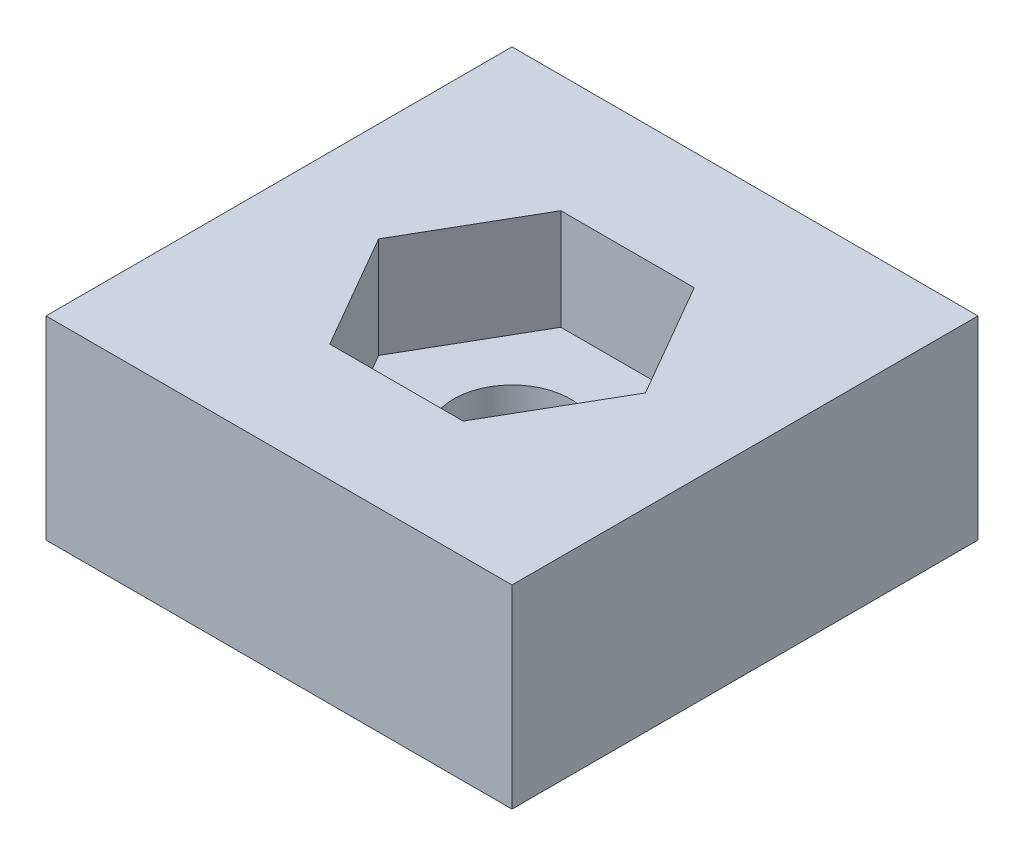
ISO-10303-21;
HEADER;
FILE_DESCRIPTION(('STEP AP214'),'2;1');
FILE_NAME('part.step','',(''),(''),'','','');
FILE_SCHEMA(('AUTOMOTIVE_DESIGN { 1 0 10303 214 1 1 1 1 }'));
ENDSEC;
DATA;
#1=APPLICATION_CONTEXT('core data for automotive mechanical design processes');
#2=APPLICATION_PROTOCOL_DEFINITION('international standard','automotive_design',2000,#1);
#3=PRODUCT_CONTEXT('',#1,'mechanical');
#4=PRODUCT('Part','Part','',(#3));
#5=PRODUCT_RELATED_PRODUCT_CATEGORY('part','',(#4));
#6=PRODUCT_DEFINITION_FORMATION('','',#4);
#7=PRODUCT_DEFINITION_CONTEXT('part definition',#1,'design');
#8=PRODUCT_DEFINITION('design','',#6,#7);
#9=PRODUCT_DEFINITION_SHAPE('','',#8);
#10=(LENGTH_UNIT() NAMED_UNIT(*) SI_UNIT(.MILLI.,.METRE.));
#11=(NAMED_UNIT(*) PLANE_ANGLE_UNIT() SI_UNIT($,.RADIAN.));
#12=(NAMED_UNIT(*) SI_UNIT($,.STERADIAN.) SOLID_ANGLE_UNIT());
#13=UNCERTAINTY_MEASURE_WITH_UNIT(LENGTH_MEASURE(1.E-05),#10,'distance_accuracy_value','');
#14=(GEOMETRIC_REPRESENTATION_CONTEXT(3) GLOBAL_UNCERTAINTY_ASSIGNED_CONTEXT((#13)) GLOBAL_UNIT_ASSIGNED_CONTEXT((#10,
#11,#12)) REPRESENTATION_CONTEXT('',''));
#15=CARTESIAN_POINT('',(0.,0.,0.));
#16=DIRECTION('',(0.,0.,1.));
#17=DIRECTION('',(1.,0.,0.));
#18=AXIS2_PLACEMENT_3D('',#15,#16,#17);
#19=CARTESIAN_POINT('',(0.,0.,0.));
#20=DIRECTION('',(0.,1.,0.));
#21=DIRECTION('',(0.,0.,1.));
#22=AXIS2_PLACEMENT_3D('',#19,#20,#21);
#23=CYLINDRICAL_SURFACE('',#22,1.5);
#24=CARTESIAN_POINT('',(0.,0.,0.));
#25=DIRECTION('',(0.,1.,0.));
#26=DIRECTION('',(0.,0.,1.));
#27=AXIS2_PLACEMENT_3D('',#24,#25,#26);
#28=CIRCLE('',#27,1.5);
#29=CARTESIAN_POINT('',(0.,0.,1.5));
#30=VERTEX_POINT('',#29);
#31=EDGE_CURVE('E204',#30,#30,#28,.T.);
#32=ORIENTED_EDGE('',*,*,#31,.F.);
#33=EDGE_LOOP('',(#32));
#34=FACE_BOUND('',#33,.T.);
#35=CARTESIAN_POINT('',(0.,2.4,0.));
#36=DIRECTION('',(0.,1.,0.));
#37=DIRECTION('',(0.,0.,1.));
#38=AXIS2_PLACEMENT_3D('',#35,#36,#37);
#39=CIRCLE('',#38,1.5);
#40=CARTESIAN_POINT('',(0.,2.4,1.5));
#41=VERTEX_POINT('',#40);
#42=EDGE_CURVE('E47',#41,#41,#39,.F.);
#43=ORIENTED_EDGE('',*,*,#42,.F.);
#44=EDGE_LOOP('',(#43));
#45=FACE_BOUND('',#44,.T.);
#46=ADVANCED_FACE('F43',(#34,#45),#23,.F.);
#47=CARTESIAN_POINT('',(6.,5.,6.));
#48=DIRECTION('',(-1.,0.,0.));
#49=DIRECTION('',(0.,0.,1.));
#50=AXIS2_PLACEMENT_3D('',#47,#48,#49);
#51=PLANE('',#50);
#52=DIRECTION('',(0.,0.,-1.));
#53=VECTOR('',#52,1.);
#54=CARTESIAN_POINT('',(6.,0.,6.));
#55=LINE('',#54,#53);
#56=CARTESIAN_POINT('',(6.,0.,6.));
#57=VERTEX_POINT('',#56);
#58=CARTESIAN_POINT('',(6.,0.,-6.));
#59=VERTEX_POINT('',#58);
#60=EDGE_CURVE('E208',#57,#59,#55,.T.);
#61=ORIENTED_EDGE('',*,*,#60,.T.);
#62=DIRECTION('',(0.,-1.,0.));
#63=VECTOR('',#62,1.);
#64=CARTESIAN_POINT('',(6.,5.,-6.));
#65=LINE('',#64,#63);
#66=CARTESIAN_POINT('',(6.,5.,-6.));
#67=VERTEX_POINT('',#66);
#68=EDGE_CURVE('E11',#67,#59,#65,.T.);
#69=ORIENTED_EDGE('',*,*,#68,.F.);
#70=DIRECTION('',(0.,0.,-1.));
#71=VECTOR('',#70,1.);
#72=CARTESIAN_POINT('',(6.,5.,6.));
#73=LINE('',#72,#71);
#74=CARTESIAN_POINT('',(6.,5.,6.));
#75=VERTEX_POINT('',#74);
#76=EDGE_CURVE('E209',#75,#67,#73,.T.);
#77=ORIENTED_EDGE('',*,*,#76,.F.);
#78=DIRECTION('',(0.,-1.,0.));
#79=VECTOR('',#78,1.);
#80=CARTESIAN_POINT('',(6.,5.,6.));
#81=LINE('',#80,#79);
#82=EDGE_CURVE('E219',#75,#57,#81,.T.);
#83=ORIENTED_EDGE('',*,*,#82,.T.);
#84=EDGE_LOOP('',(#61,#69,#77,#83));
#85=FACE_BOUND('',#84,.T.);
#86=ADVANCED_FACE('F45',(#85),#51,.F.);
#87=CARTESIAN_POINT('',(-6.,5.,-6.));
#88=DIRECTION('',(0.,0.,1.));
#89=DIRECTION('',(1.,0.,0.));
#90=AXIS2_PLACEMENT_3D('',#87,#88,#89);
#91=PLANE('',#90);
#92=DIRECTION('',(-1.,0.,0.));
#93=VECTOR('',#92,1.);
#94=CARTESIAN_POINT('',(-6.,0.,-6.));
#95=LINE('',#94,#93);
#96=CARTESIAN_POINT('',(-6.,0.,-6.));
#97=VERTEX_POINT('',#96);
#98=EDGE_CURVE('E223',#59,#97,#95,.T.);
#99=ORIENTED_EDGE('',*,*,#98,.T.);
#100=DIRECTION('',(0.,-1.,0.));
#101=VECTOR('',#100,1.);
#102=CARTESIAN_POINT('',(-6.,5.,-6.));
#103=LINE('',#102,#101);
#104=CARTESIAN_POINT('',(-6.,5.,-6.));
#105=VERTEX_POINT('',#104);
#106=EDGE_CURVE('E53',#105,#97,#103,.T.);
#107=ORIENTED_EDGE('',*,*,#106,.F.);
#108=DIRECTION('',(-1.,0.,0.));
#109=VECTOR('',#108,1.);
#110=CARTESIAN_POINT('',(-6.,5.,-6.));
#111=LINE('',#110,#109);
#112=EDGE_CURVE('E97',#67,#105,#111,.T.);
#113=ORIENTED_EDGE('',*,*,#112,.F.);
#114=ORIENTED_EDGE('',*,*,#68,.T.);
#115=EDGE_LOOP('',(#99,#107,#113,#114));
#116=FACE_BOUND('',#115,.T.);
#117=ADVANCED_FACE('F259',(#116),#91,.F.);
#118=CARTESIAN_POINT('',(-6.,5.,6.));
#119=DIRECTION('',(1.,0.,0.));
#120=DIRECTION('',(0.,0.,-1.));
#121=AXIS2_PLACEMENT_3D('',#118,#119,#120);
#122=PLANE('',#121);
#123=DIRECTION('',(0.,0.,1.));
#124=VECTOR('',#123,1.);
#125=CARTESIAN_POINT('',(-6.,0.,6.));
#126=LINE('',#125,#124);
#127=CARTESIAN_POINT('',(-6.,0.,6.));
#128=VERTEX_POINT('',#127);
#129=EDGE_CURVE('E226',#97,#128,#126,.T.);
#130=ORIENTED_EDGE('',*,*,#129,.T.);
#131=DIRECTION('',(0.,-1.,0.));
#132=VECTOR('',#131,1.);
#133=CARTESIAN_POINT('',(-6.,5.,6.));
#134=LINE('',#133,#132);
#135=CARTESIAN_POINT('',(-6.,5.,6.));
#136=VERTEX_POINT('',#135);
#137=EDGE_CURVE('E233',#136,#128,#134,.T.);
#138=ORIENTED_EDGE('',*,*,#137,.F.);
#139=DIRECTION('',(0.,0.,1.));
#140=VECTOR('',#139,1.);
#141=CARTESIAN_POINT('',(-6.,5.,6.));
#142=LINE('',#141,#140);
#143=EDGE_CURVE('E214',#105,#136,#142,.T.);
#144=ORIENTED_EDGE('',*,*,#143,.F.);
#145=ORIENTED_EDGE('',*,*,#106,.T.);
#146=EDGE_LOOP('',(#130,#138,#144,#145));
#147=FACE_BOUND('',#146,.T.);
#148=ADVANCED_FACE('F241',(#147),#122,.F.);
#149=CARTESIAN_POINT('',(-6.,5.,6.));
#150=DIRECTION('',(0.,0.,-1.));
#151=DIRECTION('',(-1.,0.,0.));
#152=AXIS2_PLACEMENT_3D('',#149,#150,#151);
#153=PLANE('',#152);
#154=DIRECTION('',(1.,0.,0.));
#155=VECTOR('',#154,1.);
#156=CARTESIAN_POINT('',(-6.,0.,6.));
#157=LINE('',#156,#155);
#158=EDGE_CURVE('E90',#128,#57,#157,.T.);
#159=ORIENTED_EDGE('',*,*,#158,.T.);
#160=ORIENTED_EDGE('',*,*,#82,.F.);
#161=DIRECTION('',(1.,0.,0.));
#162=VECTOR('',#161,1.);
#163=CARTESIAN_POINT('',(-6.,5.,6.));
#164=LINE('',#163,#162);
#165=EDGE_CURVE('E69',#136,#75,#164,.T.);
#166=ORIENTED_EDGE('',*,*,#165,.F.);
#167=ORIENTED_EDGE('',*,*,#137,.T.);
#168=EDGE_LOOP('',(#159,#160,#166,#167));
#169=FACE_BOUND('',#168,.T.);
#170=ADVANCED_FACE('F249',(#169),#153,.F.);
#171=CARTESIAN_POINT('',(0.,5.,0.));
#172=DIRECTION('',(0.,-1.,0.));
#173=DIRECTION('',(0.,0.,-1.));
#174=AXIS2_PLACEMENT_3D('',#171,#172,#173);
#175=PLANE('',#174);
#176=DIRECTION('',(-0.5,0.,-0.866025403784438));
#177=VECTOR('',#176,1.);
#178=CARTESIAN_POINT('',(3.43523410167828,5.,0.));
#179=LINE('',#178,#177);
#180=CARTESIAN_POINT('',(3.43523410167828,5.,0.));
#181=VERTEX_POINT('',#180);
#182=CARTESIAN_POINT('',(1.71761705083914,5.,-2.975));
#183=VERTEX_POINT('',#182);
#184=EDGE_CURVE('E176',#181,#183,#179,.T.);
#185=ORIENTED_EDGE('',*,*,#184,.F.);
#186=DIRECTION('',(0.5,0.,-0.866025403784439));
#187=VECTOR('',#186,1.);
#188=CARTESIAN_POINT('',(1.71761705083914,5.,2.975));
#189=LINE('',#188,#187);
#190=CARTESIAN_POINT('',(1.71761705083914,5.,2.975));
#191=VERTEX_POINT('',#190);
#192=EDGE_CURVE('E60',#191,#181,#189,.T.);
#193=ORIENTED_EDGE('',*,*,#192,.F.);
#194=DIRECTION('',(1.,0.,0.));
#195=VECTOR('',#194,1.);
#196=CARTESIAN_POINT('',(-1.71761705083914,5.,2.975));
#197=LINE('',#196,#195);
#198=CARTESIAN_POINT('',(-1.71761705083914,5.,2.975));
#199=VERTEX_POINT('',#198);
#200=EDGE_CURVE('E156',#199,#191,#197,.T.);
#201=ORIENTED_EDGE('',*,*,#200,.F.);
#202=DIRECTION('',(0.5,0.,0.866025403784439));
#203=VECTOR('',#202,1.);
#204=CARTESIAN_POINT('',(-3.43523410167827,5.,0.));
#205=LINE('',#204,#203);
#206=CARTESIAN_POINT('',(-3.43523410167827,5.,0.));
#207=VERTEX_POINT('',#206);
#208=EDGE_CURVE('E160',#207,#199,#205,.T.);
#209=ORIENTED_EDGE('',*,*,#208,.F.);
#210=DIRECTION('',(-0.5,0.,0.866025403784438));
#211=VECTOR('',#210,1.);
#212=CARTESIAN_POINT('',(-1.71761705083914,5.,-2.975));
#213=LINE('',#212,#211);
#214=CARTESIAN_POINT('',(-1.71761705083914,5.,-2.975));
#215=VERTEX_POINT('',#214);
#216=EDGE_CURVE('E183',#215,#207,#213,.T.);
#217=ORIENTED_EDGE('',*,*,#216,.F.);
#218=DIRECTION('',(-1.,0.,0.));
#219=VECTOR('',#218,1.);
#220=CARTESIAN_POINT('',(1.71761705083914,5.,-2.975));
#221=LINE('',#220,#219);
#222=EDGE_CURVE('E179',#183,#215,#221,.T.);
#223=ORIENTED_EDGE('',*,*,#222,.F.);
#224=EDGE_LOOP('',(#185,#193,#201,#209,#217,#223));
#225=FACE_BOUND('',#224,.T.);
#226=ORIENTED_EDGE('',*,*,#76,.T.);
#227=ORIENTED_EDGE('',*,*,#112,.T.);
#228=ORIENTED_EDGE('',*,*,#143,.T.);
#229=ORIENTED_EDGE('',*,*,#165,.T.);
#230=EDGE_LOOP('',(#226,#227,#228,#229));
#231=FACE_BOUND('',#230,.T.);
#232=ADVANCED_FACE('F251',(#225,#231),#175,.F.);
#233=CARTESIAN_POINT('',(0.,0.,0.));
#234=DIRECTION('',(0.,-1.,0.));
#235=DIRECTION('',(0.,0.,-1.));
#236=AXIS2_PLACEMENT_3D('',#233,#234,#235);
#237=PLANE('',#236);
#238=ORIENTED_EDGE('',*,*,#31,.T.);
#239=EDGE_LOOP('',(#238));
#240=FACE_BOUND('',#239,.T.);
#241=ORIENTED_EDGE('',*,*,#60,.F.);
#242=ORIENTED_EDGE('',*,*,#158,.F.);
#243=ORIENTED_EDGE('',*,*,#129,.F.);
#244=ORIENTED_EDGE('',*,*,#98,.F.);
#245=EDGE_LOOP('',(#241,#242,#243,#244));
#246=FACE_BOUND('',#245,.T.);
#247=ADVANCED_FACE('F245',(#240,#246),#237,.T.);
#248=CARTESIAN_POINT('',(0.,2.4,0.));
#249=DIRECTION('',(0.,1.,0.));
#250=DIRECTION('',(0.,0.,1.));
#251=AXIS2_PLACEMENT_3D('',#248,#249,#250);
#252=PLANE('',#251);
#253=DIRECTION('',(0.5,0.,-0.866025403784439));
#254=VECTOR('',#253,1.);
#255=CARTESIAN_POINT('',(1.71761705083914,2.4,2.975));
#256=LINE('',#255,#254);
#257=CARTESIAN_POINT('',(1.71761705083914,2.4,2.975));
#258=VERTEX_POINT('',#257);
#259=CARTESIAN_POINT('',(3.43523410167828,2.4,0.));
#260=VERTEX_POINT('',#259);
#261=EDGE_CURVE('E133',#258,#260,#256,.T.);
#262=ORIENTED_EDGE('',*,*,#261,.T.);
#263=DIRECTION('',(-0.5,0.,-0.866025403784438));
#264=VECTOR('',#263,1.);
#265=CARTESIAN_POINT('',(3.43523410167828,2.4,0.));
#266=LINE('',#265,#264);
#267=CARTESIAN_POINT('',(1.71761705083914,2.4,-2.975));
#268=VERTEX_POINT('',#267);
#269=EDGE_CURVE('E143',#260,#268,#266,.T.);
#270=ORIENTED_EDGE('',*,*,#269,.T.);
#271=DIRECTION('',(-1.,0.,0.));
#272=VECTOR('',#271,1.);
#273=CARTESIAN_POINT('',(1.71761705083914,2.4,-2.975));
#274=LINE('',#273,#272);
#275=CARTESIAN_POINT('',(-1.71761705083914,2.4,-2.975));
#276=VERTEX_POINT('',#275);
#277=EDGE_CURVE('E149',#268,#276,#274,.T.);
#278=ORIENTED_EDGE('',*,*,#277,.T.);
#279=DIRECTION('',(-0.5,0.,0.866025403784438));
#280=VECTOR('',#279,1.);
#281=CARTESIAN_POINT('',(-1.71761705083914,2.4,-2.975));
#282=LINE('',#281,#280);
#283=CARTESIAN_POINT('',(-3.43523410167827,2.4,0.));
#284=VERTEX_POINT('',#283);
#285=EDGE_CURVE('E165',#276,#284,#282,.T.);
#286=ORIENTED_EDGE('',*,*,#285,.T.);
#287=DIRECTION('',(0.5,0.,0.866025403784439));
#288=VECTOR('',#287,1.);
#289=CARTESIAN_POINT('',(-3.43523410167827,2.4,0.));
#290=LINE('',#289,#288);
#291=CARTESIAN_POINT('',(-1.71761705083914,2.4,2.975));
#292=VERTEX_POINT('',#291);
#293=EDGE_CURVE('E169',#284,#292,#290,.T.);
#294=ORIENTED_EDGE('',*,*,#293,.T.);
#295=DIRECTION('',(1.,0.,0.));
#296=VECTOR('',#295,1.);
#297=CARTESIAN_POINT('',(-1.71761705083914,2.4,2.975));
#298=LINE('',#297,#296);
#299=EDGE_CURVE('E140',#292,#258,#298,.T.);
#300=ORIENTED_EDGE('',*,*,#299,.T.);
#301=EDGE_LOOP('',(#262,#270,#278,#286,#294,#300));
#302=FACE_BOUND('',#301,.T.);
#303=ORIENTED_EDGE('',*,*,#42,.T.);
#304=EDGE_LOOP('',(#303));
#305=FACE_BOUND('',#304,.T.);
#306=ADVANCED_FACE('F151',(#302,#305),#252,.T.);
#307=CARTESIAN_POINT('',(1.71761705083914,2.4,2.975));
#308=DIRECTION('',(0.866025403784439,0.,0.5));
#309=DIRECTION('',(0.5,0.,-0.866025403784439));
#310=AXIS2_PLACEMENT_3D('',#307,#308,#309);
#311=PLANE('',#310);
#312=ORIENTED_EDGE('',*,*,#192,.T.);
#313=DIRECTION('',(0.,1.,0.));
#314=VECTOR('',#313,1.);
#315=CARTESIAN_POINT('',(3.43523410167828,2.4,0.));
#316=LINE('',#315,#314);
#317=EDGE_CURVE('E129',#260,#181,#316,.T.);
#318=ORIENTED_EDGE('',*,*,#317,.F.);
#319=ORIENTED_EDGE('',*,*,#261,.F.);
#320=DIRECTION('',(0.,1.,0.));
#321=VECTOR('',#320,1.);
#322=CARTESIAN_POINT('',(1.71761705083914,2.4,2.975));
#323=LINE('',#322,#321);
#324=EDGE_CURVE('E190',#258,#191,#323,.T.);
#325=ORIENTED_EDGE('',*,*,#324,.T.);
#326=EDGE_LOOP('',(#312,#318,#319,#325));
#327=FACE_BOUND('',#326,.T.);
#328=ADVANCED_FACE('F131',(#327),#311,.F.);
#329=CARTESIAN_POINT('',(-1.71761705083914,2.4,2.975));
#330=DIRECTION('',(0.,0.,1.));
#331=DIRECTION('',(1.,0.,0.));
#332=AXIS2_PLACEMENT_3D('',#329,#330,#331);
#333=PLANE('',#332);
#334=ORIENTED_EDGE('',*,*,#200,.T.);
#335=ORIENTED_EDGE('',*,*,#324,.F.);
#336=ORIENTED_EDGE('',*,*,#299,.F.);
#337=DIRECTION('',(0.,1.,0.));
#338=VECTOR('',#337,1.);
#339=CARTESIAN_POINT('',(-1.71761705083914,2.4,2.975));
#340=LINE('',#339,#338);
#341=EDGE_CURVE('E193',#292,#199,#340,.T.);
#342=ORIENTED_EDGE('',*,*,#341,.T.);
#343=EDGE_LOOP('',(#334,#335,#336,#342));
#344=FACE_BOUND('',#343,.T.);
#345=ADVANCED_FACE('F281',(#344),#333,.F.);
#346=CARTESIAN_POINT('',(-3.43523410167827,2.4,0.));
#347=DIRECTION('',(-0.866025403784438,0.,0.5));
#348=DIRECTION('',(0.5,0.,0.866025403784439));
#349=AXIS2_PLACEMENT_3D('',#346,#347,#348);
#350=PLANE('',#349);
#351=ORIENTED_EDGE('',*,*,#208,.T.);
#352=ORIENTED_EDGE('',*,*,#341,.F.);
#353=ORIENTED_EDGE('',*,*,#293,.F.);
#354=DIRECTION('',(0.,1.,0.));
#355=VECTOR('',#354,1.);
#356=CARTESIAN_POINT('',(-3.43523410167827,2.4,0.));
#357=LINE('',#356,#355);
#358=EDGE_CURVE('E196',#284,#207,#357,.T.);
#359=ORIENTED_EDGE('',*,*,#358,.T.);
#360=EDGE_LOOP('',(#351,#352,#353,#359));
#361=FACE_BOUND('',#360,.T.);
#362=ADVANCED_FACE('F285',(#361),#350,.F.);
#363=CARTESIAN_POINT('',(-1.71761705083914,2.4,-2.975));
#364=DIRECTION('',(-0.866025403784439,0.,-0.5));
#365=DIRECTION('',(-0.5,0.,0.866025403784439));
#366=AXIS2_PLACEMENT_3D('',#363,#364,#365);
#367=PLANE('',#366);
#368=ORIENTED_EDGE('',*,*,#216,.T.);
#369=ORIENTED_EDGE('',*,*,#358,.F.);
#370=ORIENTED_EDGE('',*,*,#285,.F.);
#371=DIRECTION('',(0.,1.,0.));
#372=VECTOR('',#371,1.);
#373=CARTESIAN_POINT('',(-1.71761705083914,2.4,-2.975));
#374=LINE('',#373,#372);
#375=EDGE_CURVE('E199',#276,#215,#374,.T.);
#376=ORIENTED_EDGE('',*,*,#375,.T.);
#377=EDGE_LOOP('',(#368,#369,#370,#376));
#378=FACE_BOUND('',#377,.T.);
#379=ADVANCED_FACE('F289',(#378),#367,.F.);
#380=CARTESIAN_POINT('',(1.71761705083914,2.4,-2.975));
#381=DIRECTION('',(0.,0.,-1.));
#382=DIRECTION('',(-1.,0.,0.));
#383=AXIS2_PLACEMENT_3D('',#380,#381,#382);
#384=PLANE('',#383);
#385=ORIENTED_EDGE('',*,*,#222,.T.);
#386=ORIENTED_EDGE('',*,*,#375,.F.);
#387=ORIENTED_EDGE('',*,*,#277,.F.);
#388=DIRECTION('',(0.,1.,0.));
#389=VECTOR('',#388,1.);
#390=CARTESIAN_POINT('',(1.71761705083914,2.4,-2.975));
#391=LINE('',#390,#389);
#392=EDGE_CURVE('E139',#268,#183,#391,.T.);
#393=ORIENTED_EDGE('',*,*,#392,.T.);
#394=EDGE_LOOP('',(#385,#386,#387,#393));
#395=FACE_BOUND('',#394,.T.);
#396=ADVANCED_FACE('F293',(#395),#384,.F.);
#397=CARTESIAN_POINT('',(3.43523410167828,2.4,0.));
#398=DIRECTION('',(0.866025403784438,0.,-0.5));
#399=DIRECTION('',(-0.5,0.,-0.866025403784438));
#400=AXIS2_PLACEMENT_3D('',#397,#398,#399);
#401=PLANE('',#400);
#402=ORIENTED_EDGE('',*,*,#184,.T.);
#403=ORIENTED_EDGE('',*,*,#392,.F.);
#404=ORIENTED_EDGE('',*,*,#269,.F.);
#405=ORIENTED_EDGE('',*,*,#317,.T.);
#406=EDGE_LOOP('',(#402,#403,#404,#405));
#407=FACE_BOUND('',#406,.T.);
#408=ADVANCED_FACE('F144',(#407),#401,.F.);
#409=CLOSED_SHELL('',(#46,#86,#117,#148,#170,#232,#247,#306,#328,#345,#362,#379,#396,#408));
#410=MANIFOLD_SOLID_BREP('B2',#409);
#411=ADVANCED_BREP_SHAPE_REPRESENTATION('',(#18,#410),#14);
#412=SHAPE_DEFINITION_REPRESENTATION(#9,#411);
ENDSEC;
END-ISO-10303-21;
